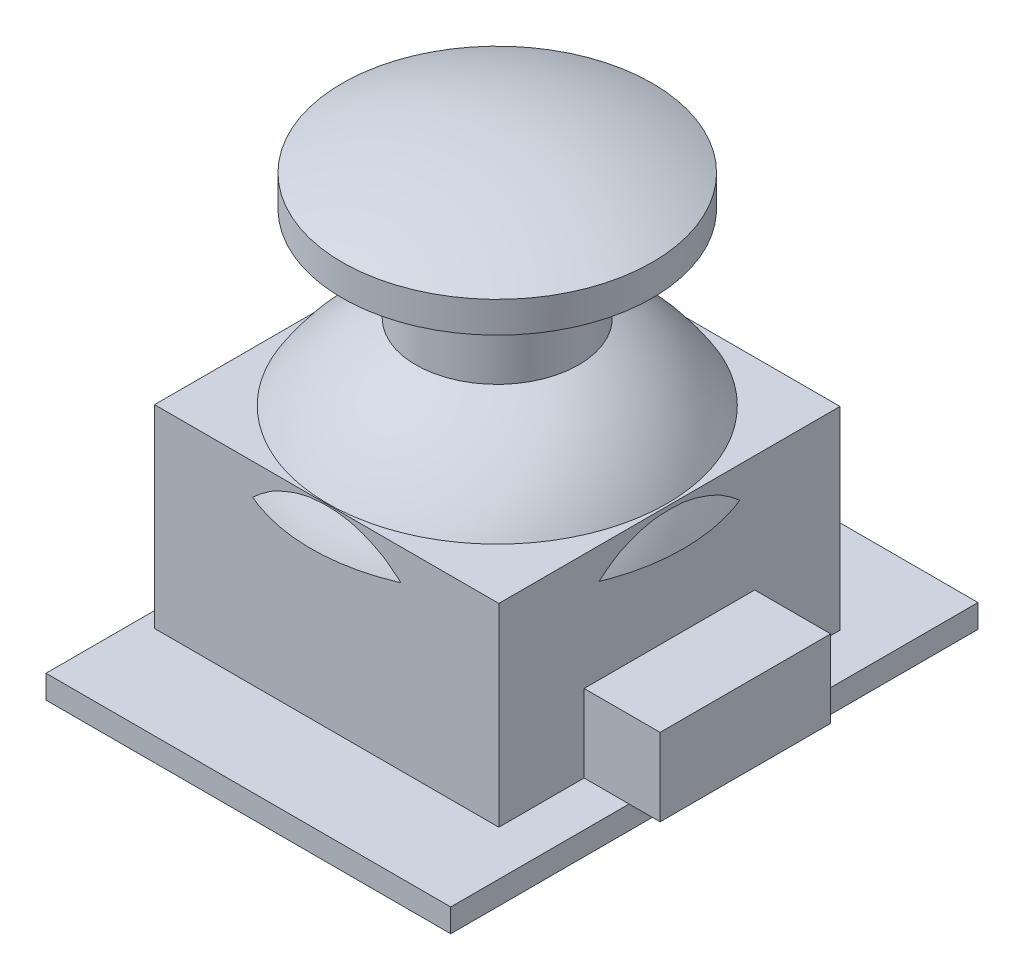
ISO-10303-21;
HEADER;
FILE_DESCRIPTION(('STEP AP214'),'2;1');
FILE_NAME('part.step','',(''),(''),'','','');
FILE_SCHEMA(('AUTOMOTIVE_DESIGN { 1 0 10303 214 1 1 1 1 }'));
ENDSEC;
DATA;
#1=APPLICATION_CONTEXT('core data for automotive mechanical design processes');
#2=APPLICATION_PROTOCOL_DEFINITION('international standard','automotive_design',2000,#1);
#3=PRODUCT_CONTEXT('',#1,'mechanical');
#4=PRODUCT('Part','Part','',(#3));
#5=PRODUCT_RELATED_PRODUCT_CATEGORY('part','',(#4));
#6=PRODUCT_DEFINITION_FORMATION('','',#4);
#7=PRODUCT_DEFINITION_CONTEXT('part definition',#1,'design');
#8=PRODUCT_DEFINITION('design','',#6,#7);
#9=PRODUCT_DEFINITION_SHAPE('','',#8);
#10=(LENGTH_UNIT() NAMED_UNIT(*) SI_UNIT(.MILLI.,.METRE.));
#11=(NAMED_UNIT(*) PLANE_ANGLE_UNIT() SI_UNIT($,.RADIAN.));
#12=(NAMED_UNIT(*) SI_UNIT($,.STERADIAN.) SOLID_ANGLE_UNIT());
#13=UNCERTAINTY_MEASURE_WITH_UNIT(LENGTH_MEASURE(1.E-05),#10,'distance_accuracy_value','');
#14=(GEOMETRIC_REPRESENTATION_CONTEXT(3) GLOBAL_UNCERTAINTY_ASSIGNED_CONTEXT((#13)) GLOBAL_UNIT_ASSIGNED_CONTEXT((#10,
#11,#12)) REPRESENTATION_CONTEXT('',''));
#15=CARTESIAN_POINT('',(0.,0.,0.));
#16=DIRECTION('',(0.,0.,1.));
#17=DIRECTION('',(1.,0.,0.));
#18=AXIS2_PLACEMENT_3D('',#15,#16,#17);
#19=CARTESIAN_POINT('',(4.3,25.0000000000001,0.));
#20=DIRECTION('',(0.,-1.,0.));
#21=DIRECTION('',(0.,0.,-1.));
#22=AXIS2_PLACEMENT_3D('',#19,#20,#21);
#23=PLANE('',#22);
#24=CARTESIAN_POINT('',(-0.95,25.0000000000001,0.));
#25=DIRECTION('',(0.,-1.,0.));
#26=DIRECTION('',(0.,0.,-1.));
#27=AXIS2_PLACEMENT_3D('',#24,#25,#26);
#28=CIRCLE('',#27,10.);
#29=CARTESIAN_POINT('',(-0.95,25.0000000000001,-10.));
#30=VERTEX_POINT('',#29);
#31=EDGE_CURVE('E78',#30,#30,#28,.T.);
#32=ORIENTED_EDGE('',*,*,#31,.T.);
#33=EDGE_LOOP('',(#32));
#34=FACE_BOUND('',#33,.T.);
#35=CARTESIAN_POINT('',(-0.95,25.0000000000001,0.));
#36=DIRECTION('',(0.,-1.,0.));
#37=DIRECTION('',(0.,0.,-1.));
#38=AXIS2_PLACEMENT_3D('',#35,#36,#37);
#39=CIRCLE('',#38,5.25);
#40=CARTESIAN_POINT('',(-0.95,25.0000000000001,-5.25));
#41=VERTEX_POINT('',#40);
#42=EDGE_CURVE('E12',#41,#41,#39,.T.);
#43=ORIENTED_EDGE('',*,*,#42,.F.);
#44=EDGE_LOOP('',(#43));
#45=FACE_BOUND('',#44,.T.);
#46=ADVANCED_FACE('F53',(#34,#45),#23,.T.);
#47=CARTESIAN_POINT('',(-0.95,-961.886040234275,0.));
#48=DIRECTION('',(0.,-1.,0.));
#49=DIRECTION('',(0.,0.,-1.));
#50=AXIS2_PLACEMENT_3D('',#47,#48,#49);
#51=CYLINDRICAL_SURFACE('',#50,5.25);
#52=ORIENTED_EDGE('',*,*,#42,.T.);
#53=EDGE_LOOP('',(#52));
#54=FACE_BOUND('',#53,.T.);
#55=CARTESIAN_POINT('',(-0.95,18.8927498922663,0.));
#56=DIRECTION('',(0.,-1.,0.));
#57=DIRECTION('',(0.,0.,-1.));
#58=AXIS2_PLACEMENT_3D('',#55,#56,#57);
#59=CIRCLE('',#58,5.25);
#60=CARTESIAN_POINT('',(4.30000000000006,18.8927498922663,0.));
#61=VERTEX_POINT('',#60);
#62=EDGE_CURVE('E59',#61,#61,#59,.T.);
#63=ORIENTED_EDGE('',*,*,#62,.F.);
#64=EDGE_LOOP('',(#63));
#65=FACE_BOUND('',#64,.T.);
#66=ADVANCED_FACE('F96',(#54,#65),#51,.T.);
#67=CARTESIAN_POINT('',(-0.95,7.00000000000012,0.));
#68=DIRECTION('',(0.,-1.,0.));
#69=DIRECTION('',(1.,0.,0.));
#70=AXIS2_PLACEMENT_3D('',#67,#68,#69);
#71=SPHERICAL_SURFACE('',#70,12.9999999999999);
#72=CARTESIAN_POINT('',(-0.95,12.0000000000001,0.));
#73=DIRECTION('',(0.,-1.,0.));
#74=DIRECTION('',(0.,0.,-1.));
#75=AXIS2_PLACEMENT_3D('',#72,#73,#74);
#76=CIRCLE('',#75,11.9999999999999);
#77=CARTESIAN_POINT('',(11.0499999999999,12.0000000000001,0.));
#78=VERTEX_POINT('',#77);
#79=EDGE_CURVE('E63',#78,#78,#76,.T.);
#80=CARTESIAN_POINT('',(4.30000000000006,18.8927498922663,0.));
#81=CARTESIAN_POINT('',(4.39418672031377,18.8511718666741,0.));
#82=CARTESIAN_POINT('',(4.48787930585906,18.8084745099224,0.));
#83=CARTESIAN_POINT('',(4.67422378465902,18.7208662206368,0.));
#84=CARTESIAN_POINT('',(4.76687567791369,18.6759552881029,0.));
#85=CARTESIAN_POINT('',(4.95108634937865,18.5839449337896,0.));
#86=CARTESIAN_POINT('',(5.04264512758895,18.5368455120101,0.));
#87=CARTESIAN_POINT('',(5.22461792063713,18.4404848358626,0.));
#88=CARTESIAN_POINT('',(5.31503193547502,18.3912235814946,0.));
#89=CARTESIAN_POINT('',(5.49466415745175,18.2905670273936,0.));
#90=CARTESIAN_POINT('',(5.58388236459059,18.2391717276606,0.));
#91=CARTESIAN_POINT('',(5.7610726131334,18.1342760986818,0.));
#92=CARTESIAN_POINT('',(5.84904465453736,18.080775769436,0.));
#93=CARTESIAN_POINT('',(6.02369291396159,17.9717002790548,0.));
#94=CARTESIAN_POINT('',(6.11036913198186,17.9161251179196,0.));
#95=CARTESIAN_POINT('',(6.2823768192463,17.8029313342759,0.));
#96=CARTESIAN_POINT('',(6.36770828849047,17.7453127117675,0.));
#97=CARTESIAN_POINT('',(6.53697831165454,17.6280645288908,0.));
#98=CARTESIAN_POINT('',(6.62091686557444,17.5684349685225,0.));
#99=CARTESIAN_POINT('',(6.78735367784997,17.4471985686642,0.));
#100=CARTESIAN_POINT('',(6.86985193620558,17.3855917291743,0.));
#101=CARTESIAN_POINT('',(7.03336159009123,17.2604355458797,0.));
#102=CARTESIAN_POINT('',(7.11437298562125,17.196886202075,0.));
#103=CARTESIAN_POINT('',(7.27486318587842,17.0678808814398,0.));
#104=CARTESIAN_POINT('',(7.35434199060556,17.0024249046093,0.));
#105=CARTESIAN_POINT('',(7.51172214637016,16.8696432654333,0.));
#106=CARTESIAN_POINT('',(7.58962349740762,16.8023176030879,0.));
#107=CARTESIAN_POINT('',(7.74380477332143,16.6658345957634,0.));
#108=CARTESIAN_POINT('',(7.82008469819778,16.5966772507843,0.));
#109=CARTESIAN_POINT('',(7.97098006455382,16.4565699149912,0.));
#110=CARTESIAN_POINT('',(8.04559550603349,16.3856199241772,0.));
#111=CARTESIAN_POINT('',(8.1931197879008,16.2419673453967,0.));
#112=CARTESIAN_POINT('',(8.26602862828843,16.1692647574302,0.));
#113=CARTESIAN_POINT('',(8.41009855359032,16.0221480223037,0.));
#114=CARTESIAN_POINT('',(8.48125963850459,15.9477338751439,0.));
#115=CARTESIAN_POINT('',(8.62179388502267,15.7972360257029,0.));
#116=CARTESIAN_POINT('',(8.69116704662649,15.7211523234219,0.));
#117=CARTESIAN_POINT('',(8.82808628790408,15.5673583102135,0.));
#118=CARTESIAN_POINT('',(8.89563236757786,15.4896479992863,0.));
#119=CARTESIAN_POINT('',(9.02885931769694,15.332644633422,0.));
#120=CARTESIAN_POINT('',(9.09454018814224,15.2533515784849,0.));
#121=CARTESIAN_POINT('',(9.22399964534833,15.0932274826384,0.));
#122=CARTESIAN_POINT('',(9.28777823210913,15.012396441729,0.));
#123=CARTESIAN_POINT('',(9.41339712126059,14.8492420001127,0.));
#124=CARTESIAN_POINT('',(9.47523742365126,14.7669185994058,0.));
#125=CARTESIAN_POINT('',(9.59694483746529,14.6008259067508,0.));
#126=CARTESIAN_POINT('',(9.65681194888864,14.5170566148028,0.));
#127=CARTESIAN_POINT('',(9.77453918797416,14.3481194243789,0.));
#128=CARTESIAN_POINT('',(9.83239931563632,14.262951525903,0.));
#129=CARTESIAN_POINT('',(9.94607992724119,14.0912651965841,0.));
#130=CARTESIAN_POINT('',(10.0019004111839,14.0047467657411,0.));
#131=CARTESIAN_POINT('',(10.1114702268212,13.8304082082306,0.));
#132=CARTESIAN_POINT('',(10.1652195585158,13.7425880815631,0.));
#133=CARTESIAN_POINT('',(10.2706167297512,13.5656957034985,0.));
#134=CARTESIAN_POINT('',(10.3222645692921,13.4766234521013,0.));
#135=CARTESIAN_POINT('',(10.4234296042724,13.2972771032259,0.));
#136=CARTESIAN_POINT('',(10.4729467997119,13.2070030057476,0.));
#137=CARTESIAN_POINT('',(10.5698225907102,13.0253039188643,0.));
#138=CARTESIAN_POINT('',(10.617181186269,12.9338789294592,0.));
#139=CARTESIAN_POINT('',(10.7097130644459,12.7499296733084,0.));
#140=CARTESIAN_POINT('',(10.754886347064,12.6574054065628,0.));
#141=CARTESIAN_POINT('',(10.8430220292575,12.4713097905297,0.));
#142=CARTESIAN_POINT('',(10.8859844288328,12.3777384412423,0.));
#143=CARTESIAN_POINT('',(10.9696743608196,12.1896015963266,0.));
#144=CARTESIAN_POINT('',(11.010401893231,12.0950361006983,0.));
#145=CARTESIAN_POINT('',(11.0499999999999,12.0000000000001,0.));
#146=B_SPLINE_CURVE_WITH_KNOTS('',3,(#80,#81,#82,#83,#84,#85,#86,#87,#88,#89,#90,#91,#92,#93,
#94,#95,#96,#97,#98,#99,#100,#101,#102,#103,#104,#105,#106,#107,#108,#109,#110,#111,#112,#113,
#114,#115,#116,#117,#118,#119,#120,#121,#122,#123,#124,#125,#126,#127,#128,#129,#130,#131,#132,
#133,#134,#135,#136,#137,#138,#139,#140,#141,#142,#143,#144,#145),.UNSPECIFIED.,.F.,.F.,(4,2,2,
2,2,2,2,2,2,2,2,2,2,2,2,2,2,2,2,2,2,2,2,2,2,2,2,2,2,2,2,2,4),(0.,0.308859735682066,
0.617719471364132,0.926579207046198,1.23543894272826,1.54429867841033,1.85315841409239,
2.16201814977446,2.47087788545653,2.77973762113859,3.08859735682066,3.39745709250272,
3.70631682818479,4.01517656386685,4.32403629954892,4.63289603523098,4.94175577091305,
5.25061550659512,5.55947524227718,5.86833497795925,6.17719471364132,6.48605444932338,
6.79491418500545,7.10377392068751,7.41263365636958,7.72149339205164,8.03035312773371,
8.33921286341577,8.64807259909784,8.9569323347799,9.26579207046197,9.57465180614404,
9.8835115418261),.UNSPECIFIED.);
#147=EDGE_CURVE('BSEAM100',#61,#78,#146,.T.);
#148=ORIENTED_EDGE('',*,*,#62,.T.);
#149=ORIENTED_EDGE('',*,*,#79,.F.);
#150=ORIENTED_EDGE('',*,*,#147,.T.);
#151=ORIENTED_EDGE('',*,*,#147,.F.);
#152=EDGE_LOOP('',(#148,#150,#149,#151));
#153=FACE_BOUND('',#152,.T.);
#154=ADVANCED_FACE('F100',(#153),#71,.T.);
#155=CARTESIAN_POINT('',(10.5064392373896,12.0000000000001,0.));
#156=DIRECTION('',(0.,-1.,0.));
#157=DIRECTION('',(0.,0.,-1.));
#158=AXIS2_PLACEMENT_3D('',#155,#156,#157);
#159=PLANE('',#158);
#160=ORIENTED_EDGE('',*,*,#79,.T.);
#161=EDGE_LOOP('',(#160));
#162=FACE_BOUND('',#161,.T.);
#163=CARTESIAN_POINT('',(-0.95,12.0000000000001,0.));
#164=DIRECTION('',(0.,-1.,0.));
#165=DIRECTION('',(0.,0.,-1.));
#166=AXIS2_PLACEMENT_3D('',#163,#164,#165);
#167=CIRCLE('',#166,11.4564392373896);
#168=CARTESIAN_POINT('',(10.5064392373895,12.0000000000001,0.));
#169=VERTEX_POINT('',#168);
#170=EDGE_CURVE('E67',#169,#169,#167,.T.);
#171=ORIENTED_EDGE('',*,*,#170,.F.);
#172=EDGE_LOOP('',(#171));
#173=FACE_BOUND('',#172,.T.);
#174=ADVANCED_FACE('F104',(#162,#173),#159,.T.);
#175=CARTESIAN_POINT('',(-0.950000000000006,7.00000000000012,0.));
#176=DIRECTION('',(0.,-1.,0.));
#177=DIRECTION('',(1.,0.,0.));
#178=AXIS2_PLACEMENT_3D('',#175,#176,#177);
#179=SPHERICAL_SURFACE('',#178,12.4999999999999);
#180=CARTESIAN_POINT('',(-0.95,18.3440513045384,0.));
#181=DIRECTION('',(0.,-1.,0.));
#182=DIRECTION('',(0.,0.,-1.));
#183=AXIS2_PLACEMENT_3D('',#180,#181,#182);
#184=CIRCLE('',#183,5.25000000000002);
#185=CARTESIAN_POINT('',(4.30000000000013,18.3440513045384,0.));
#186=VERTEX_POINT('',#185);
#187=EDGE_CURVE('E72',#186,#186,#184,.T.);
#188=CARTESIAN_POINT('',(10.5064392373895,12.0000000000001,0.));
#189=CARTESIAN_POINT('',(10.4686355545706,12.0866196139958,0.));
#190=CARTESIAN_POINT('',(10.4298491526026,12.1728103257044,0.));
#191=CARTESIAN_POINT('',(10.3503316536855,12.3442899682968,0.));
#192=CARTESIAN_POINT('',(10.3096005567365,12.4295788991805,0.));
#193=CARTESIAN_POINT('',(10.2262144111743,12.599211003872,0.));
#194=CARTESIAN_POINT('',(10.1835593625611,12.6835541776798,0.));
#195=CARTESIAN_POINT('',(10.0963473148718,12.851251402839,0.));
#196=CARTESIAN_POINT('',(10.0517903157956,12.9346054541903,0.));
#197=CARTESIAN_POINT('',(9.96079727503803,13.1002815446163,0.));
#198=CARTESIAN_POINT('',(9.91436123335662,13.1826035836909,0.));
#199=CARTESIAN_POINT('',(9.81963400119598,13.3461732996029,0.));
#200=CARTESIAN_POINT('',(9.77134281071675,13.4274209764403,0.));
#201=CARTESIAN_POINT('',(9.67293012402063,13.5888001682483,0.));
#202=CARTESIAN_POINT('',(9.62280862780375,13.6689316832188,0.));
#203=CARTESIAN_POINT('',(9.52076111570348,13.828037326531,0.));
#204=CARTESIAN_POINT('',(9.4688350998201,13.9070114548726,0.));
#205=CARTESIAN_POINT('',(9.36320526245077,14.0637616954284,0.));
#206=CARTESIAN_POINT('',(9.30950144096483,14.1415378076427,0.));
#207=CARTESIAN_POINT('',(9.20034362117312,14.2958520028294,0.));
#208=CARTESIAN_POINT('',(9.14488962286736,14.3723900858019,0.));
#209=CARTESIAN_POINT('',(9.03225997859773,14.5241888463016,0.));
#210=CARTESIAN_POINT('',(8.97508433263386,14.5994495238289,0.));
#211=CARTESIAN_POINT('',(8.8590408079451,14.748654754419,0.));
#212=CARTESIAN_POINT('',(8.80017292922022,14.8225993074818,0.));
#213=CARTESIAN_POINT('',(8.68077522449996,14.9691342472237,0.));
#214=CARTESIAN_POINT('',(8.62024539850458,15.0417246339027,0.));
#215=CARTESIAN_POINT('',(8.49755493974884,15.1855138956294,0.));
#216=CARTESIAN_POINT('',(8.43539430698847,15.2567127706772,0.));
#217=CARTESIAN_POINT('',(8.30947421420189,15.3976823797787,0.));
#218=CARTESIAN_POINT('',(8.24571475417568,15.4674531138324,0.));
#219=CARTESIAN_POINT('',(8.11662980889801,15.6055305463125,0.));
#220=CARTESIAN_POINT('',(8.05130432364655,15.6738372447387,0.));
#221=CARTESIAN_POINT('',(7.91912093562489,15.808951464526,0.));
#222=CARTESIAN_POINT('',(7.85226303285468,15.8757589858871,0.));
#223=CARTESIAN_POINT('',(7.71704920587791,16.007840481381,0.));
#224=CARTESIAN_POINT('',(7.64869328167135,16.0731144555139,0.));
#225=CARTESIAN_POINT('',(7.51051857858457,16.2020952753457,0.));
#226=CARTESIAN_POINT('',(7.44069979970435,16.2658021210447,0.));
#227=CARTESIAN_POINT('',(7.29963530662119,16.3916159090363,0.));
#228=CARTESIAN_POINT('',(7.22838959241825,16.453722851329,0.));
#229=CARTESIAN_POINT('',(7.08450788214944,16.5763048806308,0.));
#230=CARTESIAN_POINT('',(7.01187188608359,16.6367799676398,0.));
#231=CARTESIAN_POINT('',(6.86524698080104,16.7560671740306,0.));
#232=CARTESIAN_POINT('',(6.79125807158435,16.8148792934124,0.));
#233=CARTESIAN_POINT('',(6.64196540473839,16.9308103077423,0.));
#234=CARTESIAN_POINT('',(6.56666164710912,16.9879292026906,0.));
#235=CARTESIAN_POINT('',(6.41477802462381,17.10044438246,0.));
#236=CARTESIAN_POINT('',(6.33819815976777,17.1558406672812,0.));
#237=CARTESIAN_POINT('',(6.18380172051494,17.2648821273,0.));
#238=CARTESIAN_POINT('',(6.10598514611815,17.3185273024977,0.));
#239=CARTESIAN_POINT('',(5.94915532176236,17.4240389447565,0.));
#240=CARTESIAN_POINT('',(5.87014207180336,17.4759054118177,0.));
#241=CARTESIAN_POINT('',(5.71095954577016,17.5778329540084,0.));
#242=CARTESIAN_POINT('',(5.63079026969597,17.6278940291379,0.));
#243=CARTESIAN_POINT('',(5.46933693628586,17.726185033849,0.));
#244=CARTESIAN_POINT('',(5.38805287894995,17.7744149634307,0.));
#245=CARTESIAN_POINT('',(5.22441179888237,17.8690188603877,0.));
#246=CARTESIAN_POINT('',(5.14205477615071,17.915392827763,0.));
#247=CARTESIAN_POINT('',(4.97631014250623,18.0062609575243,0.));
#248=CARTESIAN_POINT('',(4.89292253159343,18.0507551199101,0.));
#249=CARTESIAN_POINT('',(4.72515959412726,18.1378406929204,0.));
#250=CARTESIAN_POINT('',(4.64078426757391,18.1804321035448,0.));
#251=CARTESIAN_POINT('',(4.47108940967204,18.2636904704474,0.));
#252=CARTESIAN_POINT('',(4.38576987832352,18.3043574267256,0.));
#253=CARTESIAN_POINT('',(4.30000000000013,18.3440513045384,0.));
#254=B_SPLINE_CURVE_WITH_KNOTS('',3,(#188,#189,#190,#191,#192,#193,#194,#195,#196,#197,#198,
#199,#200,#201,#202,#203,#204,#205,#206,#207,#208,#209,#210,#211,#212,#213,#214,#215,#216,#217,
#218,#219,#220,#221,#222,#223,#224,#225,#226,#227,#228,#229,#230,#231,#232,#233,#234,#235,#236,
#237,#238,#239,#240,#241,#242,#243,#244,#245,#246,#247,#248,#249,#250,#251,#252,#253),
.UNSPECIFIED.,.F.,.F.,(4,2,2,2,2,2,2,2,2,2,2,2,2,2,2,2,2,2,2,2,2,2,2,2,2,2,2,2,2,2,2,2,4),(0.,
0.283522891040992,0.567045782081985,0.850568673122977,1.13409156416397,1.41761445520496,
1.70113734624595,1.98466023728694,2.26818312832793,2.55170601936893,2.83522891040992,
3.11875180145091,3.4022746924919,3.68579758353289,3.96932047457388,4.25284336561488,
4.53636625665587,4.81988914769686,5.10341203873785,5.38693492977884,5.67045782081983,
5.95398071186083,6.23750360290182,6.52102649394281,6.8045493849838,7.08807227602479,
7.37159516706578,7.65511805810678,7.93864094914777,8.22216384018876,8.50568673122975,
8.78920962227074,9.07273251331173),.UNSPECIFIED.);
#255=EDGE_CURVE('BSEAM110',#169,#186,#254,.T.);
#256=ORIENTED_EDGE('',*,*,#170,.T.);
#257=ORIENTED_EDGE('',*,*,#187,.F.);
#258=ORIENTED_EDGE('',*,*,#255,.T.);
#259=ORIENTED_EDGE('',*,*,#255,.F.);
#260=EDGE_LOOP('',(#256,#258,#257,#259));
#261=FACE_BOUND('',#260,.T.);
#262=ADVANCED_FACE('F110',(#261),#179,.F.);
#263=CARTESIAN_POINT('',(4.3,18.3440513045384,0.));
#264=DIRECTION('',(0.,-1.,0.));
#265=DIRECTION('',(0.,0.,-1.));
#266=AXIS2_PLACEMENT_3D('',#263,#264,#265);
#267=PLANE('',#266);
#268=ORIENTED_EDGE('',*,*,#187,.T.);
#269=EDGE_LOOP('',(#268));
#270=FACE_BOUND('',#269,.T.);
#271=ADVANCED_FACE('F92',(#270),#267,.T.);
#272=CARTESIAN_POINT('',(-0.95,5.37272727272611,0.));
#273=DIRECTION('',(0.,-1.,0.));
#274=DIRECTION('',(1.,0.,0.));
#275=AXIS2_PLACEMENT_3D('',#272,#273,#274);
#276=SPHERICAL_SURFACE('',#275,23.8272727272739);
#277=CARTESIAN_POINT('',(-0.95,27.0000000000001,0.));
#278=DIRECTION('',(0.,-1.,0.));
#279=DIRECTION('',(0.,0.,-1.));
#280=AXIS2_PLACEMENT_3D('',#277,#278,#279);
#281=CIRCLE('',#280,10.);
#282=CARTESIAN_POINT('',(-0.95,27.0000000000001,-10.));
#283=VERTEX_POINT('',#282);
#284=EDGE_CURVE('E75',#283,#283,#281,.T.);
#285=ORIENTED_EDGE('',*,*,#284,.F.);
#286=EDGE_LOOP('',(#285));
#287=FACE_BOUND('',#286,.T.);
#288=ADVANCED_FACE('F86',(#287),#276,.T.);
#289=CARTESIAN_POINT('',(-0.95,-961.886040234275,0.));
#290=DIRECTION('',(0.,-1.,0.));
#291=DIRECTION('',(0.,0.,-1.));
#292=AXIS2_PLACEMENT_3D('',#289,#290,#291);
#293=CYLINDRICAL_SURFACE('',#292,10.);
#294=ORIENTED_EDGE('',*,*,#284,.T.);
#295=EDGE_LOOP('',(#294));
#296=FACE_BOUND('',#295,.T.);
#297=ORIENTED_EDGE('',*,*,#31,.F.);
#298=EDGE_LOOP('',(#297));
#299=FACE_BOUND('',#298,.T.);
#300=ADVANCED_FACE('F84',(#296,#299),#293,.T.);
#301=CLOSED_SHELL('',(#46,#66,#154,#174,#262,#271,#288,#300));
#302=MANIFOLD_SOLID_BREP('B2',#301);
#303=CARTESIAN_POINT('',(0.,21.5,0.));
#304=DIRECTION('',(0.,-1.,0.));
#305=DIRECTION('',(0.,0.,-1.));
#306=AXIS2_PLACEMENT_3D('',#303,#304,#305);
#307=CYLINDRICAL_SURFACE('',#306,2.);
#308=CARTESIAN_POINT('',(0.,14.,0.));
#309=DIRECTION('',(0.,1.,0.));
#310=DIRECTION('',(0.,0.,1.));
#311=AXIS2_PLACEMENT_3D('',#308,#309,#310);
#312=CIRCLE('',#311,2.);
#313=CARTESIAN_POINT('',(0.,14.,2.));
#314=VERTEX_POINT('',#313);
#315=EDGE_CURVE('E293',#314,#314,#312,.T.);
#316=ORIENTED_EDGE('',*,*,#315,.T.);
#317=EDGE_LOOP('',(#316));
#318=FACE_BOUND('',#317,.T.);
#319=DIRECTION('',(0.,1.,0.));
#320=VECTOR('',#319,1.);
#321=CARTESIAN_POINT('',(-1.5,11.3074175964327,-1.32287565553229));
#322=LINE('',#321,#320);
#323=CARTESIAN_POINT('',(-1.5,15.,-1.32287565553229));
#324=VERTEX_POINT('',#323);
#325=CARTESIAN_POINT('',(-1.5,21.5,-1.32287565553229));
#326=VERTEX_POINT('',#325);
#327=EDGE_CURVE('E271',#324,#326,#322,.T.);
#328=ORIENTED_EDGE('',*,*,#327,.T.);
#329=CARTESIAN_POINT('',(0.,21.5,0.));
#330=DIRECTION('',(0.,1.,0.));
#331=DIRECTION('',(0.,0.,1.));
#332=AXIS2_PLACEMENT_3D('',#329,#330,#331);
#333=CIRCLE('',#332,2.);
#334=CARTESIAN_POINT('',(1.5,21.5,-1.32287565553229));
#335=VERTEX_POINT('',#334);
#336=EDGE_CURVE('E278',#335,#326,#333,.T.);
#337=ORIENTED_EDGE('',*,*,#336,.F.);
#338=DIRECTION('',(0.,1.,0.));
#339=VECTOR('',#338,1.);
#340=CARTESIAN_POINT('',(1.5,11.3074175964327,-1.32287565553229));
#341=LINE('',#340,#339);
#342=CARTESIAN_POINT('',(1.5,15.,-1.32287565553229));
#343=VERTEX_POINT('',#342);
#344=EDGE_CURVE('E202',#343,#335,#341,.T.);
#345=ORIENTED_EDGE('',*,*,#344,.F.);
#346=CARTESIAN_POINT('',(0.,15.,0.));
#347=DIRECTION('',(0.,1.,0.));
#348=DIRECTION('',(0.,0.,1.));
#349=AXIS2_PLACEMENT_3D('',#346,#347,#348);
#350=CIRCLE('',#349,2.);
#351=CARTESIAN_POINT('',(1.5,15.,1.32287565553229));
#352=VERTEX_POINT('',#351);
#353=EDGE_CURVE('E187',#352,#343,#350,.T.);
#354=ORIENTED_EDGE('',*,*,#353,.F.);
#355=DIRECTION('',(0.,1.,0.));
#356=VECTOR('',#355,1.);
#357=CARTESIAN_POINT('',(1.5,11.3074175964327,1.32287565553229));
#358=LINE('',#357,#356);
#359=CARTESIAN_POINT('',(1.5,21.5,1.32287565553229));
#360=VERTEX_POINT('',#359);
#361=EDGE_CURVE('E291',#352,#360,#358,.T.);
#362=ORIENTED_EDGE('',*,*,#361,.T.);
#363=CARTESIAN_POINT('',(-1.5,21.5,1.3228756555323));
#364=VERTEX_POINT('',#363);
#365=EDGE_CURVE('E284',#364,#360,#333,.T.);
#366=ORIENTED_EDGE('',*,*,#365,.F.);
#367=DIRECTION('',(0.,1.,0.));
#368=VECTOR('',#367,1.);
#369=CARTESIAN_POINT('',(-1.5,11.3074175964327,1.32287565553229));
#370=LINE('',#369,#368);
#371=CARTESIAN_POINT('',(-1.5,15.,1.32287565553229));
#372=VERTEX_POINT('',#371);
#373=EDGE_CURVE('E194',#372,#364,#370,.T.);
#374=ORIENTED_EDGE('',*,*,#373,.F.);
#375=CARTESIAN_POINT('',(0.,15.,0.));
#376=DIRECTION('',(0.,1.,0.));
#377=DIRECTION('',(0.,0.,1.));
#378=AXIS2_PLACEMENT_3D('',#375,#376,#377);
#379=CIRCLE('',#378,2.);
#380=EDGE_CURVE('E51',#324,#372,#379,.T.);
#381=ORIENTED_EDGE('',*,*,#380,.F.);
#382=EDGE_LOOP('',(#328,#337,#345,#354,#362,#366,#374,#381));
#383=FACE_BOUND('',#382,.T.);
#384=ADVANCED_FACE('F179',(#318,#383),#307,.T.);
#385=CARTESIAN_POINT('',(0.,21.5,0.));
#386=DIRECTION('',(0.,1.,0.));
#387=DIRECTION('',(0.,0.,1.));
#388=AXIS2_PLACEMENT_3D('',#385,#386,#387);
#389=PLANE('',#388);
#390=ORIENTED_EDGE('',*,*,#336,.T.);
#391=DIRECTION('',(0.,0.,1.));
#392=VECTOR('',#391,1.);
#393=CARTESIAN_POINT('',(-1.5,21.5,-1.32287565553229));
#394=LINE('',#393,#392);
#395=EDGE_CURVE('E268',#326,#364,#394,.T.);
#396=ORIENTED_EDGE('',*,*,#395,.T.);
#397=ORIENTED_EDGE('',*,*,#365,.T.);
#398=DIRECTION('',(0.,0.,1.));
#399=VECTOR('',#398,1.);
#400=CARTESIAN_POINT('',(1.5,21.5,-1.32287565553229));
#401=LINE('',#400,#399);
#402=EDGE_CURVE('E282',#335,#360,#401,.T.);
#403=ORIENTED_EDGE('',*,*,#402,.F.);
#404=EDGE_LOOP('',(#390,#396,#397,#403));
#405=FACE_BOUND('',#404,.T.);
#406=ADVANCED_FACE('F281',(#405),#389,.T.);
#407=CARTESIAN_POINT('',(10.15,14.,-11.));
#408=DIRECTION('',(-1.,0.,0.));
#409=DIRECTION('',(0.,0.,1.));
#410=AXIS2_PLACEMENT_3D('',#407,#408,#409);
#411=PLANE('',#410);
#412=DIRECTION('',(0.,-1.,0.));
#413=VECTOR('',#412,1.);
#414=CARTESIAN_POINT('',(10.15,6.5,5.5));
#415=LINE('',#414,#413);
#416=CARTESIAN_POINT('',(10.15,6.5,5.5));
#417=VERTEX_POINT('',#416);
#418=CARTESIAN_POINT('',(10.15,1.5,5.5));
#419=VERTEX_POINT('',#418);
#420=EDGE_CURVE('E318',#417,#419,#415,.T.);
#421=ORIENTED_EDGE('',*,*,#420,.F.);
#422=DIRECTION('',(0.,0.,1.));
#423=VECTOR('',#422,1.);
#424=CARTESIAN_POINT('',(10.15,6.5,-5.5));
#425=LINE('',#424,#423);
#426=CARTESIAN_POINT('',(10.15,6.5,-5.5));
#427=VERTEX_POINT('',#426);
#428=EDGE_CURVE('E297',#427,#417,#425,.T.);
#429=ORIENTED_EDGE('',*,*,#428,.F.);
#430=DIRECTION('',(0.,-1.,0.));
#431=VECTOR('',#430,1.);
#432=CARTESIAN_POINT('',(10.15,6.5,-5.5));
#433=LINE('',#432,#431);
#434=CARTESIAN_POINT('',(10.15,1.5,-5.5));
#435=VERTEX_POINT('',#434);
#436=EDGE_CURVE('E306',#427,#435,#433,.T.);
#437=ORIENTED_EDGE('',*,*,#436,.T.);
#438=DIRECTION('',(0.,0.,-1.));
#439=VECTOR('',#438,1.);
#440=CARTESIAN_POINT('',(10.15,1.5,-11.));
#441=LINE('',#440,#439);
#442=CARTESIAN_POINT('',(10.15,1.5,-11.));
#443=VERTEX_POINT('',#442);
#444=EDGE_CURVE('E321',#435,#443,#441,.T.);
#445=ORIENTED_EDGE('',*,*,#444,.T.);
#446=DIRECTION('',(0.,-1.,0.));
#447=VECTOR('',#446,1.);
#448=CARTESIAN_POINT('',(10.15,14.,-11.));
#449=LINE('',#448,#447);
#450=CARTESIAN_POINT('',(10.15,14.,-11.));
#451=VERTEX_POINT('',#450);
#452=EDGE_CURVE('E296',#451,#443,#449,.T.);
#453=ORIENTED_EDGE('',*,*,#452,.F.);
#454=DIRECTION('',(0.,0.,-1.));
#455=VECTOR('',#454,1.);
#456=CARTESIAN_POINT('',(10.15,14.,-11.));
#457=LINE('',#456,#455);
#458=CARTESIAN_POINT('',(10.15,14.,11.));
#459=VERTEX_POINT('',#458);
#460=EDGE_CURVE('E322',#459,#451,#457,.T.);
#461=ORIENTED_EDGE('',*,*,#460,.F.);
#462=DIRECTION('',(0.,-1.,0.));
#463=VECTOR('',#462,1.);
#464=CARTESIAN_POINT('',(10.15,14.,11.));
#465=LINE('',#464,#463);
#466=CARTESIAN_POINT('',(10.15,1.5,11.));
#467=VERTEX_POINT('',#466);
#468=EDGE_CURVE('E332',#459,#467,#465,.T.);
#469=ORIENTED_EDGE('',*,*,#468,.T.);
#470=EDGE_CURVE('E333',#467,#419,#441,.T.);
#471=ORIENTED_EDGE('',*,*,#470,.T.);
#472=EDGE_LOOP('',(#421,#429,#437,#445,#453,#461,#469,#471));
#473=FACE_BOUND('',#472,.T.);
#474=ADVANCED_FACE('F181',(#473),#411,.F.);
#475=CARTESIAN_POINT('',(-12.05,14.,-11.));
#476=DIRECTION('',(0.,0.,1.));
#477=DIRECTION('',(1.,0.,0.));
#478=AXIS2_PLACEMENT_3D('',#475,#476,#477);
#479=PLANE('',#478);
#480=DIRECTION('',(-1.,0.,0.));
#481=VECTOR('',#480,1.);
#482=CARTESIAN_POINT('',(-12.05,1.5,-11.));
#483=LINE('',#482,#481);
#484=CARTESIAN_POINT('',(-12.05,1.5,-11.));
#485=VERTEX_POINT('',#484);
#486=EDGE_CURVE('E336',#443,#485,#483,.T.);
#487=ORIENTED_EDGE('',*,*,#486,.T.);
#488=DIRECTION('',(0.,-1.,0.));
#489=VECTOR('',#488,1.);
#490=CARTESIAN_POINT('',(-12.05,14.,-11.));
#491=LINE('',#490,#489);
#492=CARTESIAN_POINT('',(-12.05,14.,-11.));
#493=VERTEX_POINT('',#492);
#494=EDGE_CURVE('E346',#493,#485,#491,.T.);
#495=ORIENTED_EDGE('',*,*,#494,.F.);
#496=DIRECTION('',(-1.,0.,0.));
#497=VECTOR('',#496,1.);
#498=CARTESIAN_POINT('',(-12.05,14.,-11.));
#499=LINE('',#498,#497);
#500=EDGE_CURVE('E325',#451,#493,#499,.T.);
#501=ORIENTED_EDGE('',*,*,#500,.F.);
#502=ORIENTED_EDGE('',*,*,#452,.T.);
#503=EDGE_LOOP('',(#487,#495,#501,#502));
#504=FACE_BOUND('',#503,.T.);
#505=ADVANCED_FACE('F409',(#504),#479,.F.);
#506=CARTESIAN_POINT('',(-12.05,14.,-11.));
#507=DIRECTION('',(1.,0.,0.));
#508=DIRECTION('',(0.,0.,-1.));
#509=AXIS2_PLACEMENT_3D('',#506,#507,#508);
#510=PLANE('',#509);
#511=DIRECTION('',(0.,0.,1.));
#512=VECTOR('',#511,1.);
#513=CARTESIAN_POINT('',(-12.05,1.5,-11.));
#514=LINE('',#513,#512);
#515=CARTESIAN_POINT('',(-12.05,1.5,11.));
#516=VERTEX_POINT('',#515);
#517=EDGE_CURVE('E338',#485,#516,#514,.T.);
#518=ORIENTED_EDGE('',*,*,#517,.T.);
#519=DIRECTION('',(0.,-1.,0.));
#520=VECTOR('',#519,1.);
#521=CARTESIAN_POINT('',(-12.05,14.,11.));
#522=LINE('',#521,#520);
#523=CARTESIAN_POINT('',(-12.05,14.,11.));
#524=VERTEX_POINT('',#523);
#525=EDGE_CURVE('E343',#524,#516,#522,.T.);
#526=ORIENTED_EDGE('',*,*,#525,.F.);
#527=DIRECTION('',(0.,0.,1.));
#528=VECTOR('',#527,1.);
#529=CARTESIAN_POINT('',(-12.05,14.,-11.));
#530=LINE('',#529,#528);
#531=EDGE_CURVE('E328',#493,#524,#530,.T.);
#532=ORIENTED_EDGE('',*,*,#531,.F.);
#533=ORIENTED_EDGE('',*,*,#494,.T.);
#534=EDGE_LOOP('',(#518,#526,#532,#533));
#535=FACE_BOUND('',#534,.T.);
#536=ADVANCED_FACE('F406',(#535),#510,.F.);
#537=CARTESIAN_POINT('',(-12.05,14.,11.));
#538=DIRECTION('',(0.,0.,-1.));
#539=DIRECTION('',(-1.,0.,0.));
#540=AXIS2_PLACEMENT_3D('',#537,#538,#539);
#541=PLANE('',#540);
#542=DIRECTION('',(1.,0.,0.));
#543=VECTOR('',#542,1.);
#544=CARTESIAN_POINT('',(-12.05,1.5,11.));
#545=LINE('',#544,#543);
#546=EDGE_CURVE('E326',#516,#467,#545,.T.);
#547=ORIENTED_EDGE('',*,*,#546,.T.);
#548=ORIENTED_EDGE('',*,*,#468,.F.);
#549=DIRECTION('',(1.,0.,0.));
#550=VECTOR('',#549,1.);
#551=CARTESIAN_POINT('',(-12.05,14.,11.));
#552=LINE('',#551,#550);
#553=EDGE_CURVE('E330',#524,#459,#552,.T.);
#554=ORIENTED_EDGE('',*,*,#553,.F.);
#555=ORIENTED_EDGE('',*,*,#525,.T.);
#556=EDGE_LOOP('',(#547,#548,#554,#555));
#557=FACE_BOUND('',#556,.T.);
#558=ADVANCED_FACE('F399',(#557),#541,.F.);
#559=CARTESIAN_POINT('',(0.,14.,0.));
#560=DIRECTION('',(0.,1.,0.));
#561=DIRECTION('',(0.,0.,1.));
#562=AXIS2_PLACEMENT_3D('',#559,#560,#561);
#563=PLANE('',#562);
#564=ORIENTED_EDGE('',*,*,#315,.F.);
#565=EDGE_LOOP('',(#564));
#566=FACE_BOUND('',#565,.T.);
#567=ORIENTED_EDGE('',*,*,#460,.T.);
#568=ORIENTED_EDGE('',*,*,#500,.T.);
#569=ORIENTED_EDGE('',*,*,#531,.T.);
#570=ORIENTED_EDGE('',*,*,#553,.T.);
#571=EDGE_LOOP('',(#567,#568,#569,#570));
#572=FACE_BOUND('',#571,.T.);
#573=ADVANCED_FACE('F396',(#566,#572),#563,.T.);
#574=CARTESIAN_POINT('',(0.,1.5,0.));
#575=DIRECTION('',(0.,1.,0.));
#576=DIRECTION('',(0.,0.,1.));
#577=AXIS2_PLACEMENT_3D('',#574,#575,#576);
#578=PLANE('',#577);
#579=ORIENTED_EDGE('',*,*,#470,.F.);
#580=ORIENTED_EDGE('',*,*,#546,.F.);
#581=ORIENTED_EDGE('',*,*,#517,.F.);
#582=ORIENTED_EDGE('',*,*,#486,.F.);
#583=ORIENTED_EDGE('',*,*,#444,.F.);
#584=DIRECTION('',(-1.,0.,0.));
#585=VECTOR('',#584,1.);
#586=CARTESIAN_POINT('',(10.15,1.5,-5.5));
#587=LINE('',#586,#585);
#588=CARTESIAN_POINT('',(15.05,1.5,-5.5));
#589=VERTEX_POINT('',#588);
#590=EDGE_CURVE('E301',#589,#435,#587,.T.);
#591=ORIENTED_EDGE('',*,*,#590,.F.);
#592=DIRECTION('',(0.,0.,-1.));
#593=VECTOR('',#592,1.);
#594=CARTESIAN_POINT('',(15.05,1.5,-5.5));
#595=LINE('',#594,#593);
#596=CARTESIAN_POINT('',(15.05,1.5,5.5));
#597=VERTEX_POINT('',#596);
#598=EDGE_CURVE('E286',#597,#589,#595,.T.);
#599=ORIENTED_EDGE('',*,*,#598,.F.);
#600=DIRECTION('',(1.,0.,0.));
#601=VECTOR('',#600,1.);
#602=CARTESIAN_POINT('',(10.15,1.5,5.5));
#603=LINE('',#602,#601);
#604=EDGE_CURVE('E283',#419,#597,#603,.T.);
#605=ORIENTED_EDGE('',*,*,#604,.F.);
#606=EDGE_LOOP('',(#579,#580,#581,#582,#583,#591,#599,#605));
#607=FACE_BOUND('',#606,.T.);
#608=ADVANCED_FACE('F394',(#607),#578,.F.);
#609=CARTESIAN_POINT('',(10.15,6.5,5.5));
#610=DIRECTION('',(0.,0.,-1.));
#611=DIRECTION('',(-1.,0.,0.));
#612=AXIS2_PLACEMENT_3D('',#609,#610,#611);
#613=PLANE('',#612);
#614=ORIENTED_EDGE('',*,*,#604,.T.);
#615=DIRECTION('',(0.,-1.,0.));
#616=VECTOR('',#615,1.);
#617=CARTESIAN_POINT('',(15.05,6.5,5.5));
#618=LINE('',#617,#616);
#619=CARTESIAN_POINT('',(15.05,6.5,5.5));
#620=VERTEX_POINT('',#619);
#621=EDGE_CURVE('E315',#620,#597,#618,.T.);
#622=ORIENTED_EDGE('',*,*,#621,.F.);
#623=DIRECTION('',(1.,0.,0.));
#624=VECTOR('',#623,1.);
#625=CARTESIAN_POINT('',(10.15,6.5,5.5));
#626=LINE('',#625,#624);
#627=EDGE_CURVE('E300',#417,#620,#626,.T.);
#628=ORIENTED_EDGE('',*,*,#627,.F.);
#629=ORIENTED_EDGE('',*,*,#420,.T.);
#630=EDGE_LOOP('',(#614,#622,#628,#629));
#631=FACE_BOUND('',#630,.T.);
#632=ADVANCED_FACE('F390',(#631),#613,.F.);
#633=CARTESIAN_POINT('',(15.05,6.5,-5.5));
#634=DIRECTION('',(-1.,0.,0.));
#635=DIRECTION('',(0.,0.,1.));
#636=AXIS2_PLACEMENT_3D('',#633,#634,#635);
#637=PLANE('',#636);
#638=ORIENTED_EDGE('',*,*,#598,.T.);
#639=DIRECTION('',(0.,-1.,0.));
#640=VECTOR('',#639,1.);
#641=CARTESIAN_POINT('',(15.05,6.5,-5.5));
#642=LINE('',#641,#640);
#643=CARTESIAN_POINT('',(15.05,6.5,-5.5));
#644=VERTEX_POINT('',#643);
#645=EDGE_CURVE('E312',#644,#589,#642,.T.);
#646=ORIENTED_EDGE('',*,*,#645,.F.);
#647=DIRECTION('',(0.,0.,-1.));
#648=VECTOR('',#647,1.);
#649=CARTESIAN_POINT('',(15.05,6.5,-5.5));
#650=LINE('',#649,#648);
#651=EDGE_CURVE('E303',#620,#644,#650,.T.);
#652=ORIENTED_EDGE('',*,*,#651,.F.);
#653=ORIENTED_EDGE('',*,*,#621,.T.);
#654=EDGE_LOOP('',(#638,#646,#652,#653));
#655=FACE_BOUND('',#654,.T.);
#656=ADVANCED_FACE('F386',(#655),#637,.F.);
#657=CARTESIAN_POINT('',(10.15,6.5,-5.5));
#658=DIRECTION('',(0.,0.,1.));
#659=DIRECTION('',(1.,0.,0.));
#660=AXIS2_PLACEMENT_3D('',#657,#658,#659);
#661=PLANE('',#660);
#662=ORIENTED_EDGE('',*,*,#590,.T.);
#663=ORIENTED_EDGE('',*,*,#436,.F.);
#664=DIRECTION('',(-1.,0.,0.));
#665=VECTOR('',#664,1.);
#666=CARTESIAN_POINT('',(10.15,6.5,-5.5));
#667=LINE('',#666,#665);
#668=EDGE_CURVE('E305',#644,#427,#667,.T.);
#669=ORIENTED_EDGE('',*,*,#668,.F.);
#670=ORIENTED_EDGE('',*,*,#645,.T.);
#671=EDGE_LOOP('',(#662,#663,#669,#670));
#672=FACE_BOUND('',#671,.T.);
#673=ADVANCED_FACE('F382',(#672),#661,.F.);
#674=CARTESIAN_POINT('',(0.,6.5,0.));
#675=DIRECTION('',(0.,1.,0.));
#676=DIRECTION('',(0.,0.,1.));
#677=AXIS2_PLACEMENT_3D('',#674,#675,#676);
#678=PLANE('',#677);
#679=ORIENTED_EDGE('',*,*,#428,.T.);
#680=ORIENTED_EDGE('',*,*,#627,.T.);
#681=ORIENTED_EDGE('',*,*,#651,.T.);
#682=ORIENTED_EDGE('',*,*,#668,.T.);
#683=EDGE_LOOP('',(#679,#680,#681,#682));
#684=FACE_BOUND('',#683,.T.);
#685=ADVANCED_FACE('F379',(#684),#678,.T.);
#686=CARTESIAN_POINT('',(0.,15.,0.));
#687=DIRECTION('',(0.,1.,0.));
#688=DIRECTION('',(0.,0.,1.));
#689=AXIS2_PLACEMENT_3D('',#686,#687,#688);
#690=PLANE('',#689);
#691=DIRECTION('',(0.,0.,-1.));
#692=VECTOR('',#691,1.);
#693=CARTESIAN_POINT('',(1.5,15.,-1.32287565553229));
#694=LINE('',#693,#692);
#695=EDGE_CURVE('E288',#352,#343,#694,.T.);
#696=ORIENTED_EDGE('',*,*,#695,.F.);
#697=ORIENTED_EDGE('',*,*,#353,.T.);
#698=EDGE_LOOP('',(#696,#697));
#699=FACE_BOUND('',#698,.T.);
#700=ADVANCED_FACE('F352',(#699),#690,.T.);
#701=CARTESIAN_POINT('',(1.5,11.3074175964327,-1.32287565553229));
#702=DIRECTION('',(-1.,0.,0.));
#703=DIRECTION('',(0.,0.,1.));
#704=AXIS2_PLACEMENT_3D('',#701,#702,#703);
#705=PLANE('',#704);
#706=ORIENTED_EDGE('',*,*,#695,.T.);
#707=ORIENTED_EDGE('',*,*,#344,.T.);
#708=ORIENTED_EDGE('',*,*,#402,.T.);
#709=ORIENTED_EDGE('',*,*,#361,.F.);
#710=EDGE_LOOP('',(#706,#707,#708,#709));
#711=FACE_BOUND('',#710,.T.);
#712=ADVANCED_FACE('F355',(#711),#705,.F.);
#713=CARTESIAN_POINT('',(0.,15.,0.));
#714=DIRECTION('',(0.,1.,0.));
#715=DIRECTION('',(0.,0.,1.));
#716=AXIS2_PLACEMENT_3D('',#713,#714,#715);
#717=PLANE('',#716);
#718=DIRECTION('',(0.,0.,-1.));
#719=VECTOR('',#718,1.);
#720=CARTESIAN_POINT('',(-1.5,15.,-1.32287565553229));
#721=LINE('',#720,#719);
#722=EDGE_CURVE('E358',#372,#324,#721,.T.);
#723=ORIENTED_EDGE('',*,*,#722,.T.);
#724=ORIENTED_EDGE('',*,*,#380,.T.);
#725=EDGE_LOOP('',(#723,#724));
#726=FACE_BOUND('',#725,.T.);
#727=ADVANCED_FACE('F362',(#726),#717,.T.);
#728=CARTESIAN_POINT('',(-1.5,11.3074175964327,-1.32287565553229));
#729=DIRECTION('',(-1.,0.,0.));
#730=DIRECTION('',(0.,0.,1.));
#731=AXIS2_PLACEMENT_3D('',#728,#729,#730);
#732=PLANE('',#731);
#733=ORIENTED_EDGE('',*,*,#373,.T.);
#734=ORIENTED_EDGE('',*,*,#395,.F.);
#735=ORIENTED_EDGE('',*,*,#327,.F.);
#736=ORIENTED_EDGE('',*,*,#722,.F.);
#737=EDGE_LOOP('',(#733,#734,#735,#736));
#738=FACE_BOUND('',#737,.T.);
#739=ADVANCED_FACE('F270',(#738),#732,.T.);
#740=CLOSED_SHELL('',(#384,#406,#474,#505,#536,#558,#573,#608,#632,#656,#673,#685,#700,#712,
#727,#739));
#741=MANIFOLD_SOLID_BREP('B7',#740);
#742=CARTESIAN_POINT('',(13.05,1.5,-17.));
#743=DIRECTION('',(-1.,0.,0.));
#744=DIRECTION('',(0.,0.,1.));
#745=AXIS2_PLACEMENT_3D('',#742,#743,#744);
#746=PLANE('',#745);
#747=DIRECTION('',(0.,0.,-1.));
#748=VECTOR('',#747,1.);
#749=CARTESIAN_POINT('',(13.05,0.,-17.));
#750=LINE('',#749,#748);
#751=CARTESIAN_POINT('',(13.05,0.,17.));
#752=VERTEX_POINT('',#751);
#753=CARTESIAN_POINT('',(13.05,0.,-17.));
#754=VERTEX_POINT('',#753);
#755=EDGE_CURVE('E601',#752,#754,#750,.T.);
#756=ORIENTED_EDGE('',*,*,#755,.T.);
#757=DIRECTION('',(0.,-1.,0.));
#758=VECTOR('',#757,1.);
#759=CARTESIAN_POINT('',(13.05,1.5,-17.));
#760=LINE('',#759,#758);
#761=CARTESIAN_POINT('',(13.05,1.5,-17.));
#762=VERTEX_POINT('',#761);
#763=EDGE_CURVE('E177',#762,#754,#760,.T.);
#764=ORIENTED_EDGE('',*,*,#763,.F.);
#765=DIRECTION('',(0.,0.,-1.));
#766=VECTOR('',#765,1.);
#767=CARTESIAN_POINT('',(13.05,1.5,-17.));
#768=LINE('',#767,#766);
#769=CARTESIAN_POINT('',(13.05,1.5,17.));
#770=VERTEX_POINT('',#769);
#771=EDGE_CURVE('E589',#770,#762,#768,.T.);
#772=ORIENTED_EDGE('',*,*,#771,.F.);
#773=DIRECTION('',(0.,-1.,0.));
#774=VECTOR('',#773,1.);
#775=CARTESIAN_POINT('',(13.05,1.5,17.));
#776=LINE('',#775,#774);
#777=EDGE_CURVE('E597',#770,#752,#776,.T.);
#778=ORIENTED_EDGE('',*,*,#777,.T.);
#779=EDGE_LOOP('',(#756,#764,#772,#778));
#780=FACE_BOUND('',#779,.T.);
#781=ADVANCED_FACE('F538',(#780),#746,.F.);
#782=CARTESIAN_POINT('',(-13.05,1.5,-17.));
#783=DIRECTION('',(0.,0.,1.));
#784=DIRECTION('',(1.,0.,0.));
#785=AXIS2_PLACEMENT_3D('',#782,#783,#784);
#786=PLANE('',#785);
#787=DIRECTION('',(-1.,0.,0.));
#788=VECTOR('',#787,1.);
#789=CARTESIAN_POINT('',(-13.05,0.,-17.));
#790=LINE('',#789,#788);
#791=CARTESIAN_POINT('',(-13.05,0.,-17.));
#792=VERTEX_POINT('',#791);
#793=EDGE_CURVE('E593',#754,#792,#790,.T.);
#794=ORIENTED_EDGE('',*,*,#793,.T.);
#795=DIRECTION('',(0.,-1.,0.));
#796=VECTOR('',#795,1.);
#797=CARTESIAN_POINT('',(-13.05,1.5,-17.));
#798=LINE('',#797,#796);
#799=CARTESIAN_POINT('',(-13.05,1.5,-17.));
#800=VERTEX_POINT('',#799);
#801=EDGE_CURVE('E546',#800,#792,#798,.T.);
#802=ORIENTED_EDGE('',*,*,#801,.F.);
#803=DIRECTION('',(-1.,0.,0.));
#804=VECTOR('',#803,1.);
#805=CARTESIAN_POINT('',(-13.05,1.5,-17.));
#806=LINE('',#805,#804);
#807=EDGE_CURVE('E584',#762,#800,#806,.T.);
#808=ORIENTED_EDGE('',*,*,#807,.F.);
#809=ORIENTED_EDGE('',*,*,#763,.T.);
#810=EDGE_LOOP('',(#794,#802,#808,#809));
#811=FACE_BOUND('',#810,.T.);
#812=ADVANCED_FACE('F592',(#811),#786,.F.);
#813=CARTESIAN_POINT('',(-13.05,1.5,-17.));
#814=DIRECTION('',(1.,0.,0.));
#815=DIRECTION('',(0.,0.,-1.));
#816=AXIS2_PLACEMENT_3D('',#813,#814,#815);
#817=PLANE('',#816);
#818=DIRECTION('',(0.,0.,1.));
#819=VECTOR('',#818,1.);
#820=CARTESIAN_POINT('',(-13.05,0.,-17.));
#821=LINE('',#820,#819);
#822=CARTESIAN_POINT('',(-13.05,0.,17.));
#823=VERTEX_POINT('',#822);
#824=EDGE_CURVE('E571',#792,#823,#821,.T.);
#825=ORIENTED_EDGE('',*,*,#824,.T.);
#826=DIRECTION('',(0.,-1.,0.));
#827=VECTOR('',#826,1.);
#828=CARTESIAN_POINT('',(-13.05,1.5,17.));
#829=LINE('',#828,#827);
#830=CARTESIAN_POINT('',(-13.05,1.5,17.));
#831=VERTEX_POINT('',#830);
#832=EDGE_CURVE('E594',#831,#823,#829,.T.);
#833=ORIENTED_EDGE('',*,*,#832,.F.);
#834=DIRECTION('',(0.,0.,1.));
#835=VECTOR('',#834,1.);
#836=CARTESIAN_POINT('',(-13.05,1.5,-17.));
#837=LINE('',#836,#835);
#838=EDGE_CURVE('E587',#800,#831,#837,.T.);
#839=ORIENTED_EDGE('',*,*,#838,.F.);
#840=ORIENTED_EDGE('',*,*,#801,.T.);
#841=EDGE_LOOP('',(#825,#833,#839,#840));
#842=FACE_BOUND('',#841,.T.);
#843=ADVANCED_FACE('F595',(#842),#817,.F.);
#844=CARTESIAN_POINT('',(-13.05,1.5,17.));
#845=DIRECTION('',(0.,0.,-1.));
#846=DIRECTION('',(-1.,0.,0.));
#847=AXIS2_PLACEMENT_3D('',#844,#845,#846);
#848=PLANE('',#847);
#849=DIRECTION('',(1.,0.,0.));
#850=VECTOR('',#849,1.);
#851=CARTESIAN_POINT('',(-13.05,0.,17.));
#852=LINE('',#851,#850);
#853=EDGE_CURVE('E577',#823,#752,#852,.T.);
#854=ORIENTED_EDGE('',*,*,#853,.T.);
#855=ORIENTED_EDGE('',*,*,#777,.F.);
#856=DIRECTION('',(1.,0.,0.));
#857=VECTOR('',#856,1.);
#858=CARTESIAN_POINT('',(-13.05,1.5,17.));
#859=LINE('',#858,#857);
#860=EDGE_CURVE('E554',#831,#770,#859,.T.);
#861=ORIENTED_EDGE('',*,*,#860,.F.);
#862=ORIENTED_EDGE('',*,*,#832,.T.);
#863=EDGE_LOOP('',(#854,#855,#861,#862));
#864=FACE_BOUND('',#863,.T.);
#865=ADVANCED_FACE('F608',(#864),#848,.F.);
#866=CARTESIAN_POINT('',(0.,1.5,0.));
#867=DIRECTION('',(0.,1.,0.));
#868=DIRECTION('',(0.,0.,1.));
#869=AXIS2_PLACEMENT_3D('',#866,#867,#868);
#870=PLANE('',#869);
#871=ORIENTED_EDGE('',*,*,#771,.T.);
#872=ORIENTED_EDGE('',*,*,#807,.T.);
#873=ORIENTED_EDGE('',*,*,#838,.T.);
#874=ORIENTED_EDGE('',*,*,#860,.T.);
#875=EDGE_LOOP('',(#871,#872,#873,#874));
#876=FACE_BOUND('',#875,.T.);
#877=ADVANCED_FACE('F585',(#876),#870,.T.);
#878=CARTESIAN_POINT('',(0.,0.,0.));
#879=DIRECTION('',(0.,1.,0.));
#880=DIRECTION('',(0.,0.,1.));
#881=AXIS2_PLACEMENT_3D('',#878,#879,#880);
#882=PLANE('',#881);
#883=ORIENTED_EDGE('',*,*,#755,.F.);
#884=ORIENTED_EDGE('',*,*,#853,.F.);
#885=ORIENTED_EDGE('',*,*,#824,.F.);
#886=ORIENTED_EDGE('',*,*,#793,.F.);
#887=EDGE_LOOP('',(#883,#884,#885,#886));
#888=FACE_BOUND('',#887,.T.);
#889=ADVANCED_FACE('F611',(#888),#882,.F.);
#890=CLOSED_SHELL('',(#781,#812,#843,#865,#877,#889));
#891=MANIFOLD_SOLID_BREP('B45',#890);
#892=ADVANCED_BREP_SHAPE_REPRESENTATION('',(#18,#302,#741,#891),#14);
#893=SHAPE_DEFINITION_REPRESENTATION(#9,#892);
ENDSEC;
END-ISO-10303-21;
